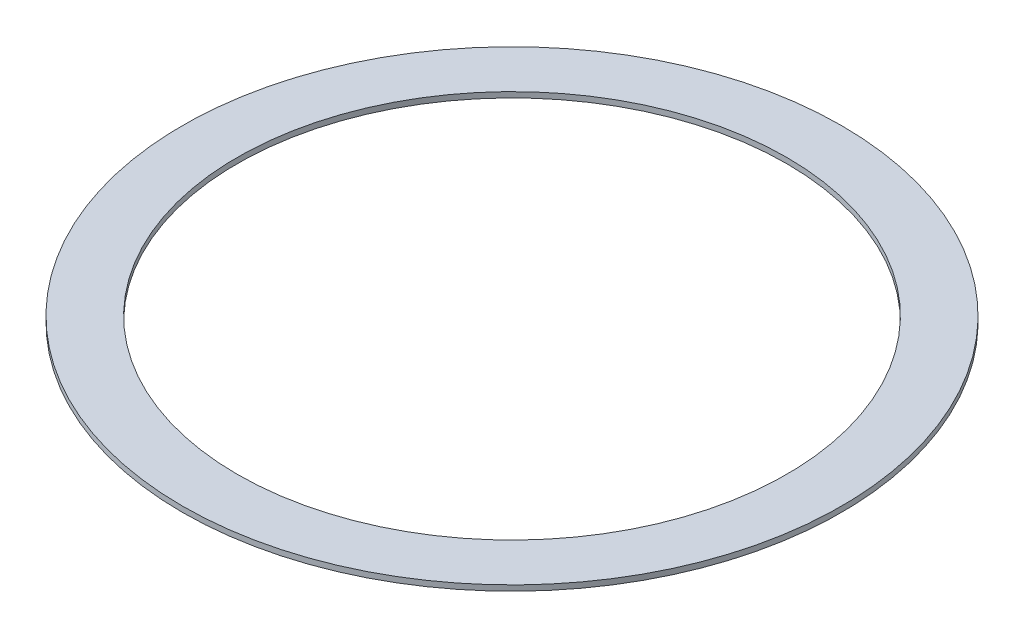
ISO-10303-21;
HEADER;
FILE_DESCRIPTION(('STEP AP214'),'2;1');
FILE_NAME('part.step','',(''),(''),'','','');
FILE_SCHEMA(('AUTOMOTIVE_DESIGN { 1 0 10303 214 1 1 1 1 }'));
ENDSEC;
DATA;
#1=APPLICATION_CONTEXT('core data for automotive mechanical design processes');
#2=APPLICATION_PROTOCOL_DEFINITION('international standard','automotive_design',2000,#1);
#3=PRODUCT_CONTEXT('',#1,'mechanical');
#4=PRODUCT('Part','Part','',(#3));
#5=PRODUCT_RELATED_PRODUCT_CATEGORY('part','',(#4));
#6=PRODUCT_DEFINITION_FORMATION('','',#4);
#7=PRODUCT_DEFINITION_CONTEXT('part definition',#1,'design');
#8=PRODUCT_DEFINITION('design','',#6,#7);
#9=PRODUCT_DEFINITION_SHAPE('','',#8);
#10=(LENGTH_UNIT() NAMED_UNIT(*) SI_UNIT(.MILLI.,.METRE.));
#11=(NAMED_UNIT(*) PLANE_ANGLE_UNIT() SI_UNIT($,.RADIAN.));
#12=(NAMED_UNIT(*) SI_UNIT($,.STERADIAN.) SOLID_ANGLE_UNIT());
#13=UNCERTAINTY_MEASURE_WITH_UNIT(LENGTH_MEASURE(1.E-05),#10,'distance_accuracy_value','');
#14=(GEOMETRIC_REPRESENTATION_CONTEXT(3) GLOBAL_UNCERTAINTY_ASSIGNED_CONTEXT((#13)) GLOBAL_UNIT_ASSIGNED_CONTEXT((#10,
#11,#12)) REPRESENTATION_CONTEXT('',''));
#15=CARTESIAN_POINT('',(0.,0.,0.));
#16=DIRECTION('',(0.,0.,1.));
#17=DIRECTION('',(1.,0.,0.));
#18=AXIS2_PLACEMENT_3D('',#15,#16,#17);
#19=CARTESIAN_POINT('',(0.,0.,0.));
#20=DIRECTION('',(0.,-1.,0.));
#21=DIRECTION('',(0.,0.,-1.));
#22=AXIS2_PLACEMENT_3D('',#19,#20,#21);
#23=CYLINDRICAL_SURFACE('',#22,2.5);
#24=CARTESIAN_POINT('',(0.,4.16923265076414,0.));
#25=DIRECTION('',(0.,-1.,0.));
#26=DIRECTION('',(0.,0.,-1.));
#27=AXIS2_PLACEMENT_3D('',#24,#25,#26);
#28=CIRCLE('',#27,2.5);
#29=CARTESIAN_POINT('',(0.,4.16923265076414,-2.5));
#30=VERTEX_POINT('',#29);
#31=EDGE_CURVE('E47',#30,#30,#28,.T.);
#32=ORIENTED_EDGE('',*,*,#31,.T.);
#33=EDGE_LOOP('',(#32));
#34=FACE_BOUND('',#33,.T.);
#35=CARTESIAN_POINT('',(0.,4.21923265076414,0.));
#36=DIRECTION('',(0.,-1.,0.));
#37=DIRECTION('',(0.,0.,-1.));
#38=AXIS2_PLACEMENT_3D('',#35,#36,#37);
#39=CIRCLE('',#38,2.5);
#40=CARTESIAN_POINT('',(0.,4.21923265076414,-2.5));
#41=VERTEX_POINT('',#40);
#42=EDGE_CURVE('E10',#41,#41,#39,.T.);
#43=ORIENTED_EDGE('',*,*,#42,.F.);
#44=EDGE_LOOP('',(#43));
#45=FACE_BOUND('',#44,.T.);
#46=ADVANCED_FACE('F33',(#34,#45),#23,.F.);
#47=CARTESIAN_POINT('',(2.5,4.21923265076414,0.));
#48=DIRECTION('',(0.,1.,0.));
#49=DIRECTION('',(0.,0.,1.));
#50=AXIS2_PLACEMENT_3D('',#47,#48,#49);
#51=PLANE('',#50);
#52=ORIENTED_EDGE('',*,*,#42,.T.);
#53=EDGE_LOOP('',(#52));
#54=FACE_BOUND('',#53,.T.);
#55=CARTESIAN_POINT('',(0.,4.21923265076414,0.));
#56=DIRECTION('',(0.,-1.,0.));
#57=DIRECTION('',(0.,0.,-1.));
#58=AXIS2_PLACEMENT_3D('',#55,#56,#57);
#59=CIRCLE('',#58,3.);
#60=CARTESIAN_POINT('',(0.,4.21923265076414,-3.));
#61=VERTEX_POINT('',#60);
#62=EDGE_CURVE('E39',#61,#61,#59,.T.);
#63=ORIENTED_EDGE('',*,*,#62,.F.);
#64=EDGE_LOOP('',(#63));
#65=FACE_BOUND('',#64,.T.);
#66=ADVANCED_FACE('F63',(#54,#65),#51,.T.);
#67=CARTESIAN_POINT('',(0.,0.,0.));
#68=DIRECTION('',(0.,-1.,0.));
#69=DIRECTION('',(0.,0.,-1.));
#70=AXIS2_PLACEMENT_3D('',#67,#68,#69);
#71=CYLINDRICAL_SURFACE('',#70,3.);
#72=ORIENTED_EDGE('',*,*,#62,.T.);
#73=EDGE_LOOP('',(#72));
#74=FACE_BOUND('',#73,.T.);
#75=CARTESIAN_POINT('',(0.,4.16923265076414,0.));
#76=DIRECTION('',(0.,-1.,0.));
#77=DIRECTION('',(0.,0.,-1.));
#78=AXIS2_PLACEMENT_3D('',#75,#76,#77);
#79=CIRCLE('',#78,3.);
#80=CARTESIAN_POINT('',(0.,4.16923265076414,-3.));
#81=VERTEX_POINT('',#80);
#82=EDGE_CURVE('E43',#81,#81,#79,.T.);
#83=ORIENTED_EDGE('',*,*,#82,.F.);
#84=EDGE_LOOP('',(#83));
#85=FACE_BOUND('',#84,.T.);
#86=ADVANCED_FACE('F57',(#74,#85),#71,.T.);
#87=CARTESIAN_POINT('',(2.5,4.16923265076414,0.));
#88=DIRECTION('',(0.,-1.,0.));
#89=DIRECTION('',(0.,0.,-1.));
#90=AXIS2_PLACEMENT_3D('',#87,#88,#89);
#91=PLANE('',#90);
#92=ORIENTED_EDGE('',*,*,#82,.T.);
#93=EDGE_LOOP('',(#92));
#94=FACE_BOUND('',#93,.T.);
#95=ORIENTED_EDGE('',*,*,#31,.F.);
#96=EDGE_LOOP('',(#95));
#97=FACE_BOUND('',#96,.T.);
#98=ADVANCED_FACE('F55',(#94,#97),#91,.T.);
#99=CLOSED_SHELL('',(#46,#66,#86,#98));
#100=MANIFOLD_SOLID_BREP('B2',#99);
#101=ADVANCED_BREP_SHAPE_REPRESENTATION('',(#18,#100),#14);
#102=SHAPE_DEFINITION_REPRESENTATION(#9,#101);
ENDSEC;
END-ISO-10303-21;
